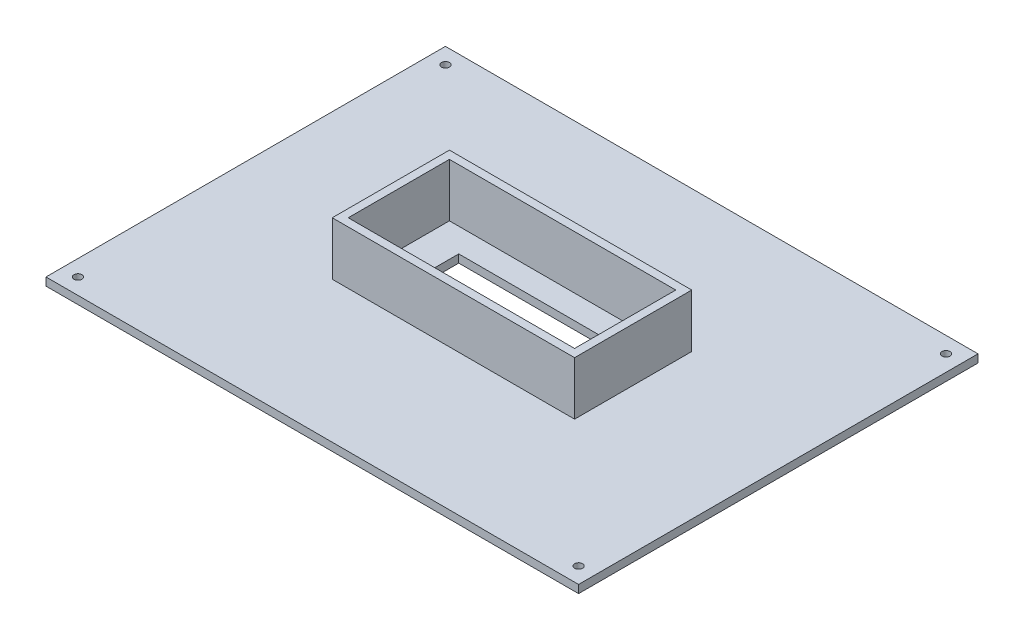
ISO-10303-21;
HEADER;
FILE_DESCRIPTION(('STEP AP214'),'2;1');
FILE_NAME('part.step','',(''),(''),'','','');
FILE_SCHEMA(('AUTOMOTIVE_DESIGN { 1 0 10303 214 1 1 1 1 }'));
ENDSEC;
DATA;
#1=APPLICATION_CONTEXT('core data for automotive mechanical design processes');
#2=APPLICATION_PROTOCOL_DEFINITION('international standard','automotive_design',2000,#1);
#3=PRODUCT_CONTEXT('',#1,'mechanical');
#4=PRODUCT('Part','Part','',(#3));
#5=PRODUCT_RELATED_PRODUCT_CATEGORY('part','',(#4));
#6=PRODUCT_DEFINITION_FORMATION('','',#4);
#7=PRODUCT_DEFINITION_CONTEXT('part definition',#1,'design');
#8=PRODUCT_DEFINITION('design','',#6,#7);
#9=PRODUCT_DEFINITION_SHAPE('','',#8);
#10=(LENGTH_UNIT() NAMED_UNIT(*) SI_UNIT(.MILLI.,.METRE.));
#11=(NAMED_UNIT(*) PLANE_ANGLE_UNIT() SI_UNIT($,.RADIAN.));
#12=(NAMED_UNIT(*) SI_UNIT($,.STERADIAN.) SOLID_ANGLE_UNIT());
#13=UNCERTAINTY_MEASURE_WITH_UNIT(LENGTH_MEASURE(1.E-05),#10,'distance_accuracy_value','');
#14=(GEOMETRIC_REPRESENTATION_CONTEXT(3) GLOBAL_UNCERTAINTY_ASSIGNED_CONTEXT((#13)) GLOBAL_UNIT_ASSIGNED_CONTEXT((#10,
#11,#12)) REPRESENTATION_CONTEXT('',''));
#15=CARTESIAN_POINT('',(0.,0.,0.));
#16=DIRECTION('',(0.,0.,1.));
#17=DIRECTION('',(1.,0.,0.));
#18=AXIS2_PLACEMENT_3D('',#15,#16,#17);
#19=CARTESIAN_POINT('',(0.,3.,0.));
#20=DIRECTION('',(0.,1.,0.));
#21=DIRECTION('',(0.,0.,1.));
#22=AXIS2_PLACEMENT_3D('',#19,#20,#21);
#23=PLANE('',#22);
#24=CARTESIAN_POINT('',(94.,3.,-69.));
#25=DIRECTION('',(0.,1.,0.));
#26=DIRECTION('',(0.,0.,-1.));
#27=AXIS2_PLACEMENT_3D('',#24,#25,#26);
#28=CIRCLE('',#27,1.5);
#29=CARTESIAN_POINT('',(94.,3.,-70.5));
#30=VERTEX_POINT('',#29);
#31=EDGE_CURVE('E302',#30,#30,#28,.T.);
#32=ORIENTED_EDGE('',*,*,#31,.F.);
#33=EDGE_LOOP('',(#32));
#34=FACE_BOUND('',#33,.T.);
#35=CARTESIAN_POINT('',(-94.,3.,69.));
#36=DIRECTION('',(0.,1.,0.));
#37=DIRECTION('',(0.,0.,-1.));
#38=AXIS2_PLACEMENT_3D('',#35,#36,#37);
#39=CIRCLE('',#38,1.5);
#40=CARTESIAN_POINT('',(-94.,3.,67.5));
#41=VERTEX_POINT('',#40);
#42=EDGE_CURVE('E293',#41,#41,#39,.T.);
#43=ORIENTED_EDGE('',*,*,#42,.F.);
#44=EDGE_LOOP('',(#43));
#45=FACE_BOUND('',#44,.T.);
#46=CARTESIAN_POINT('',(-94.,3.,-69.));
#47=DIRECTION('',(0.,1.,0.));
#48=DIRECTION('',(0.,0.,1.));
#49=AXIS2_PLACEMENT_3D('',#46,#47,#48);
#50=CIRCLE('',#49,1.5);
#51=CARTESIAN_POINT('',(-94.,3.,-67.5));
#52=VERTEX_POINT('',#51);
#53=EDGE_CURVE('E279',#52,#52,#50,.T.);
#54=ORIENTED_EDGE('',*,*,#53,.F.);
#55=EDGE_LOOP('',(#54));
#56=FACE_BOUND('',#55,.T.);
#57=CARTESIAN_POINT('',(94.,3.,69.));
#58=DIRECTION('',(0.,1.,0.));
#59=DIRECTION('',(0.,0.,1.));
#60=AXIS2_PLACEMENT_3D('',#57,#58,#59);
#61=CIRCLE('',#60,1.5);
#62=CARTESIAN_POINT('',(94.,3.,70.5));
#63=VERTEX_POINT('',#62);
#64=EDGE_CURVE('E301',#63,#63,#61,.T.);
#65=ORIENTED_EDGE('',*,*,#64,.F.);
#66=EDGE_LOOP('',(#65));
#67=FACE_BOUND('',#66,.T.);
#68=DIRECTION('',(0.,0.,-1.));
#69=VECTOR('',#68,1.);
#70=CARTESIAN_POINT('',(100.,3.,-75.));
#71=LINE('',#70,#69);
#72=CARTESIAN_POINT('',(100.,3.,75.));
#73=VERTEX_POINT('',#72);
#74=CARTESIAN_POINT('',(100.,3.,-75.));
#75=VERTEX_POINT('',#74);
#76=EDGE_CURVE('E321',#73,#75,#71,.T.);
#77=ORIENTED_EDGE('',*,*,#76,.T.);
#78=DIRECTION('',(-1.,0.,0.));
#79=VECTOR('',#78,1.);
#80=CARTESIAN_POINT('',(-100.,3.,-75.));
#81=LINE('',#80,#79);
#82=CARTESIAN_POINT('',(-100.,3.,-75.));
#83=VERTEX_POINT('',#82);
#84=EDGE_CURVE('E325',#75,#83,#81,.T.);
#85=ORIENTED_EDGE('',*,*,#84,.T.);
#86=DIRECTION('',(0.,0.,1.));
#87=VECTOR('',#86,1.);
#88=CARTESIAN_POINT('',(-100.,3.,-75.));
#89=LINE('',#88,#87);
#90=CARTESIAN_POINT('',(-100.,3.,75.));
#91=VERTEX_POINT('',#90);
#92=EDGE_CURVE('E329',#83,#91,#89,.T.);
#93=ORIENTED_EDGE('',*,*,#92,.T.);
#94=DIRECTION('',(1.,0.,0.));
#95=VECTOR('',#94,1.);
#96=CARTESIAN_POINT('',(-100.,3.,75.));
#97=LINE('',#96,#95);
#98=EDGE_CURVE('E332',#91,#73,#97,.T.);
#99=ORIENTED_EDGE('',*,*,#98,.T.);
#100=EDGE_LOOP('',(#77,#85,#93,#99));
#101=FACE_BOUND('',#100,.T.);
#102=DIRECTION('',(1.,0.,0.));
#103=VECTOR('',#102,1.);
#104=CARTESIAN_POINT('',(-45.5,3.,22.));
#105=LINE('',#104,#103);
#106=CARTESIAN_POINT('',(-45.5,3.,22.));
#107=VERTEX_POINT('',#106);
#108=CARTESIAN_POINT('',(45.5,3.,22.));
#109=VERTEX_POINT('',#108);
#110=EDGE_CURVE('E224',#107,#109,#105,.T.);
#111=ORIENTED_EDGE('',*,*,#110,.F.);
#112=DIRECTION('',(0.,0.,1.));
#113=VECTOR('',#112,1.);
#114=CARTESIAN_POINT('',(-45.5,3.,-22.));
#115=LINE('',#114,#113);
#116=CARTESIAN_POINT('',(-45.5,3.,-22.));
#117=VERTEX_POINT('',#116);
#118=EDGE_CURVE('E174',#117,#107,#115,.T.);
#119=ORIENTED_EDGE('',*,*,#118,.F.);
#120=DIRECTION('',(-1.,0.,0.));
#121=VECTOR('',#120,1.);
#122=CARTESIAN_POINT('',(-45.5,3.,-22.));
#123=LINE('',#122,#121);
#124=CARTESIAN_POINT('',(45.5,3.,-22.));
#125=VERTEX_POINT('',#124);
#126=EDGE_CURVE('E211',#125,#117,#123,.T.);
#127=ORIENTED_EDGE('',*,*,#126,.F.);
#128=DIRECTION('',(0.,0.,-1.));
#129=VECTOR('',#128,1.);
#130=CARTESIAN_POINT('',(45.5,3.,-22.));
#131=LINE('',#130,#129);
#132=EDGE_CURVE('E227',#109,#125,#131,.T.);
#133=ORIENTED_EDGE('',*,*,#132,.F.);
#134=EDGE_LOOP('',(#111,#119,#127,#133));
#135=FACE_BOUND('',#134,.T.);
#136=ADVANCED_FACE('F39',(#34,#45,#56,#67,#101,#135),#23,.T.);
#137=CARTESIAN_POINT('',(100.,3.,-75.));
#138=DIRECTION('',(-1.,0.,0.));
#139=DIRECTION('',(0.,0.,1.));
#140=AXIS2_PLACEMENT_3D('',#137,#138,#139);
#141=PLANE('',#140);
#142=DIRECTION('',(0.,0.,-1.));
#143=VECTOR('',#142,1.);
#144=CARTESIAN_POINT('',(100.,0.,-75.));
#145=LINE('',#144,#143);
#146=CARTESIAN_POINT('',(100.,0.,75.));
#147=VERTEX_POINT('',#146);
#148=CARTESIAN_POINT('',(100.,0.,-75.));
#149=VERTEX_POINT('',#148);
#150=EDGE_CURVE('E317',#147,#149,#145,.T.);
#151=ORIENTED_EDGE('',*,*,#150,.T.);
#152=DIRECTION('',(0.,-1.,0.));
#153=VECTOR('',#152,1.);
#154=CARTESIAN_POINT('',(100.,3.,-75.));
#155=LINE('',#154,#153);
#156=EDGE_CURVE('E11',#75,#149,#155,.T.);
#157=ORIENTED_EDGE('',*,*,#156,.F.);
#158=ORIENTED_EDGE('',*,*,#76,.F.);
#159=DIRECTION('',(0.,-1.,0.));
#160=VECTOR('',#159,1.);
#161=CARTESIAN_POINT('',(100.,3.,75.));
#162=LINE('',#161,#160);
#163=EDGE_CURVE('E335',#73,#147,#162,.T.);
#164=ORIENTED_EDGE('',*,*,#163,.T.);
#165=EDGE_LOOP('',(#151,#157,#158,#164));
#166=FACE_BOUND('',#165,.T.);
#167=ADVANCED_FACE('F41',(#166),#141,.F.);
#168=CARTESIAN_POINT('',(-100.,3.,-75.));
#169=DIRECTION('',(0.,0.,1.));
#170=DIRECTION('',(1.,0.,0.));
#171=AXIS2_PLACEMENT_3D('',#168,#169,#170);
#172=PLANE('',#171);
#173=DIRECTION('',(-1.,0.,0.));
#174=VECTOR('',#173,1.);
#175=CARTESIAN_POINT('',(-100.,0.,-75.));
#176=LINE('',#175,#174);
#177=CARTESIAN_POINT('',(-100.,0.,-75.));
#178=VERTEX_POINT('',#177);
#179=EDGE_CURVE('E339',#149,#178,#176,.T.);
#180=ORIENTED_EDGE('',*,*,#179,.T.);
#181=DIRECTION('',(0.,-1.,0.));
#182=VECTOR('',#181,1.);
#183=CARTESIAN_POINT('',(-100.,3.,-75.));
#184=LINE('',#183,#182);
#185=EDGE_CURVE('E48',#83,#178,#184,.T.);
#186=ORIENTED_EDGE('',*,*,#185,.F.);
#187=ORIENTED_EDGE('',*,*,#84,.F.);
#188=ORIENTED_EDGE('',*,*,#156,.T.);
#189=EDGE_LOOP('',(#180,#186,#187,#188));
#190=FACE_BOUND('',#189,.T.);
#191=ADVANCED_FACE('F375',(#190),#172,.F.);
#192=CARTESIAN_POINT('',(-100.,3.,-75.));
#193=DIRECTION('',(1.,0.,0.));
#194=DIRECTION('',(0.,0.,-1.));
#195=AXIS2_PLACEMENT_3D('',#192,#193,#194);
#196=PLANE('',#195);
#197=DIRECTION('',(0.,0.,1.));
#198=VECTOR('',#197,1.);
#199=CARTESIAN_POINT('',(-100.,0.,-75.));
#200=LINE('',#199,#198);
#201=CARTESIAN_POINT('',(-100.,0.,75.));
#202=VERTEX_POINT('',#201);
#203=EDGE_CURVE('E342',#178,#202,#200,.T.);
#204=ORIENTED_EDGE('',*,*,#203,.T.);
#205=DIRECTION('',(0.,-1.,0.));
#206=VECTOR('',#205,1.);
#207=CARTESIAN_POINT('',(-100.,3.,75.));
#208=LINE('',#207,#206);
#209=EDGE_CURVE('E350',#91,#202,#208,.T.);
#210=ORIENTED_EDGE('',*,*,#209,.F.);
#211=ORIENTED_EDGE('',*,*,#92,.F.);
#212=ORIENTED_EDGE('',*,*,#185,.T.);
#213=EDGE_LOOP('',(#204,#210,#211,#212));
#214=FACE_BOUND('',#213,.T.);
#215=ADVANCED_FACE('F359',(#214),#196,.F.);
#216=CARTESIAN_POINT('',(-100.,3.,75.));
#217=DIRECTION('',(0.,0.,-1.));
#218=DIRECTION('',(-1.,0.,0.));
#219=AXIS2_PLACEMENT_3D('',#216,#217,#218);
#220=PLANE('',#219);
#221=DIRECTION('',(1.,0.,0.));
#222=VECTOR('',#221,1.);
#223=CARTESIAN_POINT('',(-100.,0.,75.));
#224=LINE('',#223,#222);
#225=EDGE_CURVE('E326',#202,#147,#224,.T.);
#226=ORIENTED_EDGE('',*,*,#225,.T.);
#227=ORIENTED_EDGE('',*,*,#163,.F.);
#228=ORIENTED_EDGE('',*,*,#98,.F.);
#229=ORIENTED_EDGE('',*,*,#209,.T.);
#230=EDGE_LOOP('',(#226,#227,#228,#229));
#231=FACE_BOUND('',#230,.T.);
#232=ADVANCED_FACE('F368',(#231),#220,.F.);
#233=DIRECTION('',(0.,0.,-1.));
#234=VECTOR('',#233,1.);
#235=CARTESIAN_POINT('',(42.5,3.,-19.));
#236=LINE('',#235,#234);
#237=CARTESIAN_POINT('',(42.5,3.,19.));
#238=VERTEX_POINT('',#237);
#239=CARTESIAN_POINT('',(42.5,3.,-19.));
#240=VERTEX_POINT('',#239);
#241=EDGE_CURVE('E63',#238,#240,#236,.T.);
#242=ORIENTED_EDGE('',*,*,#241,.T.);
#243=DIRECTION('',(-1.,0.,0.));
#244=VECTOR('',#243,1.);
#245=CARTESIAN_POINT('',(-42.5,3.,-19.));
#246=LINE('',#245,#244);
#247=CARTESIAN_POINT('',(-42.5,3.,-19.));
#248=VERTEX_POINT('',#247);
#249=EDGE_CURVE('E172',#240,#248,#246,.T.);
#250=ORIENTED_EDGE('',*,*,#249,.T.);
#251=DIRECTION('',(0.,0.,1.));
#252=VECTOR('',#251,1.);
#253=CARTESIAN_POINT('',(-42.5,3.,-19.));
#254=LINE('',#253,#252);
#255=CARTESIAN_POINT('',(-42.5,3.,19.));
#256=VERTEX_POINT('',#255);
#257=EDGE_CURVE('E193',#248,#256,#254,.T.);
#258=ORIENTED_EDGE('',*,*,#257,.T.);
#259=DIRECTION('',(1.,0.,0.));
#260=VECTOR('',#259,1.);
#261=CARTESIAN_POINT('',(-42.5,3.,19.));
#262=LINE('',#261,#260);
#263=EDGE_CURVE('E166',#256,#238,#262,.T.);
#264=ORIENTED_EDGE('',*,*,#263,.T.);
#265=EDGE_LOOP('',(#242,#250,#258,#264));
#266=FACE_BOUND('',#265,.T.);
#267=DIRECTION('',(0.,0.,-1.));
#268=VECTOR('',#267,1.);
#269=CARTESIAN_POINT('',(30.,3.,-10.));
#270=LINE('',#269,#268);
#271=CARTESIAN_POINT('',(30.,3.,9.99999999999999));
#272=VERTEX_POINT('',#271);
#273=CARTESIAN_POINT('',(30.,3.,-10.));
#274=VERTEX_POINT('',#273);
#275=EDGE_CURVE('E244',#272,#274,#270,.T.);
#276=ORIENTED_EDGE('',*,*,#275,.F.);
#277=DIRECTION('',(1.,0.,0.));
#278=VECTOR('',#277,1.);
#279=CARTESIAN_POINT('',(-30.,3.,9.99999999999999));
#280=LINE('',#279,#278);
#281=CARTESIAN_POINT('',(-30.,3.,9.99999999999999));
#282=VERTEX_POINT('',#281);
#283=EDGE_CURVE('E250',#282,#272,#280,.T.);
#284=ORIENTED_EDGE('',*,*,#283,.F.);
#285=DIRECTION('',(0.,0.,1.));
#286=VECTOR('',#285,1.);
#287=CARTESIAN_POINT('',(-30.,3.,-10.));
#288=LINE('',#287,#286);
#289=CARTESIAN_POINT('',(-30.,3.,-10.));
#290=VERTEX_POINT('',#289);
#291=EDGE_CURVE('E269',#290,#282,#288,.T.);
#292=ORIENTED_EDGE('',*,*,#291,.F.);
#293=DIRECTION('',(-1.,0.,0.));
#294=VECTOR('',#293,1.);
#295=CARTESIAN_POINT('',(-30.,3.,-10.));
#296=LINE('',#295,#294);
#297=EDGE_CURVE('E265',#274,#290,#296,.T.);
#298=ORIENTED_EDGE('',*,*,#297,.F.);
#299=EDGE_LOOP('',(#276,#284,#292,#298));
#300=FACE_BOUND('',#299,.T.);
#301=ADVANCED_FACE('F385',(#266,#300),#23,.T.);
#302=CARTESIAN_POINT('',(0.,0.,0.));
#303=DIRECTION('',(0.,1.,0.));
#304=DIRECTION('',(0.,0.,1.));
#305=AXIS2_PLACEMENT_3D('',#302,#303,#304);
#306=PLANE('',#305);
#307=DIRECTION('',(1.,0.,0.));
#308=VECTOR('',#307,1.);
#309=CARTESIAN_POINT('',(-30.,0.,9.99999999999999));
#310=LINE('',#309,#308);
#311=CARTESIAN_POINT('',(-30.,0.,9.99999999999999));
#312=VERTEX_POINT('',#311);
#313=CARTESIAN_POINT('',(30.,0.,9.99999999999999));
#314=VERTEX_POINT('',#313);
#315=EDGE_CURVE('E258',#312,#314,#310,.T.);
#316=ORIENTED_EDGE('',*,*,#315,.T.);
#317=DIRECTION('',(0.,0.,-1.));
#318=VECTOR('',#317,1.);
#319=CARTESIAN_POINT('',(30.,0.,-10.));
#320=LINE('',#319,#318);
#321=CARTESIAN_POINT('',(30.,0.,-10.));
#322=VERTEX_POINT('',#321);
#323=EDGE_CURVE('E245',#314,#322,#320,.T.);
#324=ORIENTED_EDGE('',*,*,#323,.T.);
#325=DIRECTION('',(-1.,0.,0.));
#326=VECTOR('',#325,1.);
#327=CARTESIAN_POINT('',(-30.,0.,-10.));
#328=LINE('',#327,#326);
#329=CARTESIAN_POINT('',(-30.,0.,-10.));
#330=VERTEX_POINT('',#329);
#331=EDGE_CURVE('E249',#322,#330,#328,.T.);
#332=ORIENTED_EDGE('',*,*,#331,.T.);
#333=DIRECTION('',(0.,0.,1.));
#334=VECTOR('',#333,1.);
#335=CARTESIAN_POINT('',(-30.,0.,-10.));
#336=LINE('',#335,#334);
#337=EDGE_CURVE('E254',#330,#312,#336,.T.);
#338=ORIENTED_EDGE('',*,*,#337,.T.);
#339=EDGE_LOOP('',(#316,#324,#332,#338));
#340=FACE_BOUND('',#339,.T.);
#341=CARTESIAN_POINT('',(94.,0.,-69.));
#342=DIRECTION('',(0.,1.,0.));
#343=DIRECTION('',(0.,0.,-1.));
#344=AXIS2_PLACEMENT_3D('',#341,#342,#343);
#345=CIRCLE('',#344,1.5);
#346=CARTESIAN_POINT('',(94.,0.,-70.5));
#347=VERTEX_POINT('',#346);
#348=EDGE_CURVE('E297',#347,#347,#345,.T.);
#349=ORIENTED_EDGE('',*,*,#348,.T.);
#350=EDGE_LOOP('',(#349));
#351=FACE_BOUND('',#350,.T.);
#352=CARTESIAN_POINT('',(-94.,0.,69.));
#353=DIRECTION('',(0.,1.,0.));
#354=DIRECTION('',(0.,0.,-1.));
#355=AXIS2_PLACEMENT_3D('',#352,#353,#354);
#356=CIRCLE('',#355,1.5);
#357=CARTESIAN_POINT('',(-94.,0.,67.5));
#358=VERTEX_POINT('',#357);
#359=EDGE_CURVE('E306',#358,#358,#356,.T.);
#360=ORIENTED_EDGE('',*,*,#359,.T.);
#361=EDGE_LOOP('',(#360));
#362=FACE_BOUND('',#361,.T.);
#363=CARTESIAN_POINT('',(-94.,0.,-69.));
#364=DIRECTION('',(0.,1.,0.));
#365=DIRECTION('',(0.,0.,1.));
#366=AXIS2_PLACEMENT_3D('',#363,#364,#365);
#367=CIRCLE('',#366,1.5);
#368=CARTESIAN_POINT('',(-94.,0.,-67.5));
#369=VERTEX_POINT('',#368);
#370=EDGE_CURVE('E289',#369,#369,#367,.T.);
#371=ORIENTED_EDGE('',*,*,#370,.T.);
#372=EDGE_LOOP('',(#371));
#373=FACE_BOUND('',#372,.T.);
#374=CARTESIAN_POINT('',(94.,0.,69.));
#375=DIRECTION('',(0.,1.,0.));
#376=DIRECTION('',(0.,0.,1.));
#377=AXIS2_PLACEMENT_3D('',#374,#375,#376);
#378=CIRCLE('',#377,1.5);
#379=CARTESIAN_POINT('',(94.,0.,70.5));
#380=VERTEX_POINT('',#379);
#381=EDGE_CURVE('E313',#380,#380,#378,.T.);
#382=ORIENTED_EDGE('',*,*,#381,.T.);
#383=EDGE_LOOP('',(#382));
#384=FACE_BOUND('',#383,.T.);
#385=ORIENTED_EDGE('',*,*,#150,.F.);
#386=ORIENTED_EDGE('',*,*,#225,.F.);
#387=ORIENTED_EDGE('',*,*,#203,.F.);
#388=ORIENTED_EDGE('',*,*,#179,.F.);
#389=EDGE_LOOP('',(#385,#386,#387,#388));
#390=FACE_BOUND('',#389,.T.);
#391=ADVANCED_FACE('F365',(#340,#351,#362,#373,#384,#390),#306,.F.);
#392=CARTESIAN_POINT('',(94.,0.,69.));
#393=DIRECTION('',(0.,1.,0.));
#394=DIRECTION('',(0.,0.,1.));
#395=AXIS2_PLACEMENT_3D('',#392,#393,#394);
#396=CYLINDRICAL_SURFACE('',#395,1.5);
#397=ORIENTED_EDGE('',*,*,#381,.F.);
#398=EDGE_LOOP('',(#397));
#399=FACE_BOUND('',#398,.T.);
#400=ORIENTED_EDGE('',*,*,#64,.T.);
#401=EDGE_LOOP('',(#400));
#402=FACE_BOUND('',#401,.T.);
#403=ADVANCED_FACE('F397',(#399,#402),#396,.F.);
#404=CARTESIAN_POINT('',(-94.,0.,-69.));
#405=DIRECTION('',(0.,1.,0.));
#406=DIRECTION('',(0.,0.,1.));
#407=AXIS2_PLACEMENT_3D('',#404,#405,#406);
#408=CYLINDRICAL_SURFACE('',#407,1.5);
#409=ORIENTED_EDGE('',*,*,#370,.F.);
#410=EDGE_LOOP('',(#409));
#411=FACE_BOUND('',#410,.T.);
#412=ORIENTED_EDGE('',*,*,#53,.T.);
#413=EDGE_LOOP('',(#412));
#414=FACE_BOUND('',#413,.T.);
#415=ADVANCED_FACE('F431',(#411,#414),#408,.F.);
#416=CARTESIAN_POINT('',(-94.,0.,69.));
#417=DIRECTION('',(0.,1.,0.));
#418=DIRECTION('',(0.,0.,1.));
#419=AXIS2_PLACEMENT_3D('',#416,#417,#418);
#420=CYLINDRICAL_SURFACE('',#419,1.5);
#421=ORIENTED_EDGE('',*,*,#359,.F.);
#422=EDGE_LOOP('',(#421));
#423=FACE_BOUND('',#422,.T.);
#424=ORIENTED_EDGE('',*,*,#42,.T.);
#425=EDGE_LOOP('',(#424));
#426=FACE_BOUND('',#425,.T.);
#427=ADVANCED_FACE('F434',(#423,#426),#420,.F.);
#428=CARTESIAN_POINT('',(94.,0.,-69.));
#429=DIRECTION('',(0.,1.,0.));
#430=DIRECTION('',(0.,0.,1.));
#431=AXIS2_PLACEMENT_3D('',#428,#429,#430);
#432=CYLINDRICAL_SURFACE('',#431,1.5);
#433=ORIENTED_EDGE('',*,*,#348,.F.);
#434=EDGE_LOOP('',(#433));
#435=FACE_BOUND('',#434,.T.);
#436=ORIENTED_EDGE('',*,*,#31,.T.);
#437=EDGE_LOOP('',(#436));
#438=FACE_BOUND('',#437,.T.);
#439=ADVANCED_FACE('F430',(#435,#438),#432,.F.);
#440=CARTESIAN_POINT('',(30.,0.,-10.));
#441=DIRECTION('',(1.,0.,0.));
#442=DIRECTION('',(0.,0.,-1.));
#443=AXIS2_PLACEMENT_3D('',#440,#441,#442);
#444=PLANE('',#443);
#445=ORIENTED_EDGE('',*,*,#275,.T.);
#446=DIRECTION('',(0.,1.,0.));
#447=VECTOR('',#446,1.);
#448=CARTESIAN_POINT('',(30.,0.,-10.));
#449=LINE('',#448,#447);
#450=EDGE_CURVE('E262',#322,#274,#449,.T.);
#451=ORIENTED_EDGE('',*,*,#450,.F.);
#452=ORIENTED_EDGE('',*,*,#323,.F.);
#453=DIRECTION('',(0.,1.,0.));
#454=VECTOR('',#453,1.);
#455=CARTESIAN_POINT('',(30.,0.,9.99999999999999));
#456=LINE('',#455,#454);
#457=EDGE_CURVE('E276',#314,#272,#456,.T.);
#458=ORIENTED_EDGE('',*,*,#457,.T.);
#459=EDGE_LOOP('',(#445,#451,#452,#458));
#460=FACE_BOUND('',#459,.T.);
#461=ADVANCED_FACE('F406',(#460),#444,.F.);
#462=CARTESIAN_POINT('',(-30.,0.,9.99999999999999));
#463=DIRECTION('',(0.,0.,1.));
#464=DIRECTION('',(1.,0.,0.));
#465=AXIS2_PLACEMENT_3D('',#462,#463,#464);
#466=PLANE('',#465);
#467=ORIENTED_EDGE('',*,*,#283,.T.);
#468=ORIENTED_EDGE('',*,*,#457,.F.);
#469=ORIENTED_EDGE('',*,*,#315,.F.);
#470=DIRECTION('',(0.,1.,0.));
#471=VECTOR('',#470,1.);
#472=CARTESIAN_POINT('',(-30.,0.,9.99999999999999));
#473=LINE('',#472,#471);
#474=EDGE_CURVE('E280',#312,#282,#473,.T.);
#475=ORIENTED_EDGE('',*,*,#474,.T.);
#476=EDGE_LOOP('',(#467,#468,#469,#475));
#477=FACE_BOUND('',#476,.T.);
#478=ADVANCED_FACE('F415',(#477),#466,.F.);
#479=CARTESIAN_POINT('',(-30.,0.,-10.));
#480=DIRECTION('',(-1.,0.,0.));
#481=DIRECTION('',(0.,0.,1.));
#482=AXIS2_PLACEMENT_3D('',#479,#480,#481);
#483=PLANE('',#482);
#484=ORIENTED_EDGE('',*,*,#291,.T.);
#485=ORIENTED_EDGE('',*,*,#474,.F.);
#486=ORIENTED_EDGE('',*,*,#337,.F.);
#487=DIRECTION('',(0.,1.,0.));
#488=VECTOR('',#487,1.);
#489=CARTESIAN_POINT('',(-30.,0.,-10.));
#490=LINE('',#489,#488);
#491=EDGE_CURVE('E283',#330,#290,#490,.T.);
#492=ORIENTED_EDGE('',*,*,#491,.T.);
#493=EDGE_LOOP('',(#484,#485,#486,#492));
#494=FACE_BOUND('',#493,.T.);
#495=ADVANCED_FACE('F417',(#494),#483,.F.);
#496=CARTESIAN_POINT('',(-30.,0.,-10.));
#497=DIRECTION('',(0.,0.,-1.));
#498=DIRECTION('',(-1.,0.,0.));
#499=AXIS2_PLACEMENT_3D('',#496,#497,#498);
#500=PLANE('',#499);
#501=ORIENTED_EDGE('',*,*,#297,.T.);
#502=ORIENTED_EDGE('',*,*,#491,.F.);
#503=ORIENTED_EDGE('',*,*,#331,.F.);
#504=ORIENTED_EDGE('',*,*,#450,.T.);
#505=EDGE_LOOP('',(#501,#502,#503,#504));
#506=FACE_BOUND('',#505,.T.);
#507=ADVANCED_FACE('F410',(#506),#500,.F.);
#508=CARTESIAN_POINT('',(0.,23.,0.));
#509=DIRECTION('',(0.,1.,0.));
#510=DIRECTION('',(0.,0.,1.));
#511=AXIS2_PLACEMENT_3D('',#508,#509,#510);
#512=PLANE('',#511);
#513=DIRECTION('',(0.,0.,1.));
#514=VECTOR('',#513,1.);
#515=CARTESIAN_POINT('',(-45.5,23.,-22.));
#516=LINE('',#515,#514);
#517=CARTESIAN_POINT('',(-45.5,23.,-22.));
#518=VERTEX_POINT('',#517);
#519=CARTESIAN_POINT('',(-45.5,23.,22.));
#520=VERTEX_POINT('',#519);
#521=EDGE_CURVE('E206',#518,#520,#516,.T.);
#522=ORIENTED_EDGE('',*,*,#521,.T.);
#523=DIRECTION('',(1.,0.,0.));
#524=VECTOR('',#523,1.);
#525=CARTESIAN_POINT('',(-45.5,23.,22.));
#526=LINE('',#525,#524);
#527=CARTESIAN_POINT('',(45.5,23.,22.));
#528=VERTEX_POINT('',#527);
#529=EDGE_CURVE('E210',#520,#528,#526,.T.);
#530=ORIENTED_EDGE('',*,*,#529,.T.);
#531=DIRECTION('',(0.,0.,-1.));
#532=VECTOR('',#531,1.);
#533=CARTESIAN_POINT('',(45.5,23.,-22.));
#534=LINE('',#533,#532);
#535=CARTESIAN_POINT('',(45.5,23.,-22.));
#536=VERTEX_POINT('',#535);
#537=EDGE_CURVE('E214',#528,#536,#534,.T.);
#538=ORIENTED_EDGE('',*,*,#537,.T.);
#539=DIRECTION('',(-1.,0.,0.));
#540=VECTOR('',#539,1.);
#541=CARTESIAN_POINT('',(-45.5,23.,-22.));
#542=LINE('',#541,#540);
#543=EDGE_CURVE('E217',#536,#518,#542,.T.);
#544=ORIENTED_EDGE('',*,*,#543,.T.);
#545=EDGE_LOOP('',(#522,#530,#538,#544));
#546=FACE_BOUND('',#545,.T.);
#547=DIRECTION('',(-1.,0.,0.));
#548=VECTOR('',#547,1.);
#549=CARTESIAN_POINT('',(-42.5,23.,-19.));
#550=LINE('',#549,#548);
#551=CARTESIAN_POINT('',(42.5,23.,-19.));
#552=VERTEX_POINT('',#551);
#553=CARTESIAN_POINT('',(-42.5,23.,-19.));
#554=VERTEX_POINT('',#553);
#555=EDGE_CURVE('E165',#552,#554,#550,.T.);
#556=ORIENTED_EDGE('',*,*,#555,.F.);
#557=DIRECTION('',(0.,0.,-1.));
#558=VECTOR('',#557,1.);
#559=CARTESIAN_POINT('',(42.5,23.,-19.));
#560=LINE('',#559,#558);
#561=CARTESIAN_POINT('',(42.5,23.,19.));
#562=VERTEX_POINT('',#561);
#563=EDGE_CURVE('E155',#562,#552,#560,.T.);
#564=ORIENTED_EDGE('',*,*,#563,.F.);
#565=DIRECTION('',(1.,0.,0.));
#566=VECTOR('',#565,1.);
#567=CARTESIAN_POINT('',(-42.5,23.,19.));
#568=LINE('',#567,#566);
#569=CARTESIAN_POINT('',(-42.5,23.,19.));
#570=VERTEX_POINT('',#569);
#571=EDGE_CURVE('E184',#570,#562,#568,.T.);
#572=ORIENTED_EDGE('',*,*,#571,.F.);
#573=DIRECTION('',(0.,0.,1.));
#574=VECTOR('',#573,1.);
#575=CARTESIAN_POINT('',(-42.5,23.,-19.));
#576=LINE('',#575,#574);
#577=EDGE_CURVE('E180',#554,#570,#576,.T.);
#578=ORIENTED_EDGE('',*,*,#577,.F.);
#579=EDGE_LOOP('',(#556,#564,#572,#578));
#580=FACE_BOUND('',#579,.T.);
#581=ADVANCED_FACE('F178',(#546,#580),#512,.T.);
#582=CARTESIAN_POINT('',(-45.5,23.,-22.));
#583=DIRECTION('',(1.,0.,0.));
#584=DIRECTION('',(0.,0.,-1.));
#585=AXIS2_PLACEMENT_3D('',#582,#583,#584);
#586=PLANE('',#585);
#587=ORIENTED_EDGE('',*,*,#118,.T.);
#588=DIRECTION('',(0.,-1.,0.));
#589=VECTOR('',#588,1.);
#590=CARTESIAN_POINT('',(-45.5,23.,22.));
#591=LINE('',#590,#589);
#592=EDGE_CURVE('E241',#520,#107,#591,.T.);
#593=ORIENTED_EDGE('',*,*,#592,.F.);
#594=ORIENTED_EDGE('',*,*,#521,.F.);
#595=DIRECTION('',(0.,-1.,0.));
#596=VECTOR('',#595,1.);
#597=CARTESIAN_POINT('',(-45.5,23.,-22.));
#598=LINE('',#597,#596);
#599=EDGE_CURVE('E220',#518,#117,#598,.T.);
#600=ORIENTED_EDGE('',*,*,#599,.T.);
#601=EDGE_LOOP('',(#587,#593,#594,#600));
#602=FACE_BOUND('',#601,.T.);
#603=ADVANCED_FACE('F502',(#602),#586,.F.);
#604=CARTESIAN_POINT('',(-45.5,23.,22.));
#605=DIRECTION('',(0.,0.,-1.));
#606=DIRECTION('',(-1.,0.,0.));
#607=AXIS2_PLACEMENT_3D('',#604,#605,#606);
#608=PLANE('',#607);
#609=ORIENTED_EDGE('',*,*,#110,.T.);
#610=DIRECTION('',(0.,-1.,0.));
#611=VECTOR('',#610,1.);
#612=CARTESIAN_POINT('',(45.5,23.,22.));
#613=LINE('',#612,#611);
#614=EDGE_CURVE('E237',#528,#109,#613,.T.);
#615=ORIENTED_EDGE('',*,*,#614,.F.);
#616=ORIENTED_EDGE('',*,*,#529,.F.);
#617=ORIENTED_EDGE('',*,*,#592,.T.);
#618=EDGE_LOOP('',(#609,#615,#616,#617));
#619=FACE_BOUND('',#618,.T.);
#620=ADVANCED_FACE('F512',(#619),#608,.F.);
#621=CARTESIAN_POINT('',(45.5,23.,-22.));
#622=DIRECTION('',(-1.,0.,0.));
#623=DIRECTION('',(0.,0.,1.));
#624=AXIS2_PLACEMENT_3D('',#621,#622,#623);
#625=PLANE('',#624);
#626=ORIENTED_EDGE('',*,*,#132,.T.);
#627=DIRECTION('',(0.,-1.,0.));
#628=VECTOR('',#627,1.);
#629=CARTESIAN_POINT('',(45.5,23.,-22.));
#630=LINE('',#629,#628);
#631=EDGE_CURVE('E55',#536,#125,#630,.T.);
#632=ORIENTED_EDGE('',*,*,#631,.F.);
#633=ORIENTED_EDGE('',*,*,#537,.F.);
#634=ORIENTED_EDGE('',*,*,#614,.T.);
#635=EDGE_LOOP('',(#626,#632,#633,#634));
#636=FACE_BOUND('',#635,.T.);
#637=ADVANCED_FACE('F521',(#636),#625,.F.);
#638=CARTESIAN_POINT('',(-45.5,23.,-22.));
#639=DIRECTION('',(0.,0.,1.));
#640=DIRECTION('',(1.,0.,0.));
#641=AXIS2_PLACEMENT_3D('',#638,#639,#640);
#642=PLANE('',#641);
#643=ORIENTED_EDGE('',*,*,#126,.T.);
#644=ORIENTED_EDGE('',*,*,#599,.F.);
#645=ORIENTED_EDGE('',*,*,#543,.F.);
#646=ORIENTED_EDGE('',*,*,#631,.T.);
#647=EDGE_LOOP('',(#643,#644,#645,#646));
#648=FACE_BOUND('',#647,.T.);
#649=ADVANCED_FACE('F531',(#648),#642,.F.);
#650=CARTESIAN_POINT('',(42.5,23.,-19.));
#651=DIRECTION('',(-1.,0.,0.));
#652=DIRECTION('',(0.,0.,1.));
#653=AXIS2_PLACEMENT_3D('',#650,#651,#652);
#654=PLANE('',#653);
#655=ORIENTED_EDGE('',*,*,#241,.F.);
#656=DIRECTION('',(0.,-1.,0.));
#657=VECTOR('',#656,1.);
#658=CARTESIAN_POINT('',(42.5,23.,19.));
#659=LINE('',#658,#657);
#660=EDGE_CURVE('E160',#562,#238,#659,.T.);
#661=ORIENTED_EDGE('',*,*,#660,.F.);
#662=ORIENTED_EDGE('',*,*,#563,.T.);
#663=DIRECTION('',(0.,-1.,0.));
#664=VECTOR('',#663,1.);
#665=CARTESIAN_POINT('',(42.5,23.,-19.));
#666=LINE('',#665,#664);
#667=EDGE_CURVE('E158',#552,#240,#666,.T.);
#668=ORIENTED_EDGE('',*,*,#667,.T.);
#669=EDGE_LOOP('',(#655,#661,#662,#668));
#670=FACE_BOUND('',#669,.T.);
#671=ADVANCED_FACE('F157',(#670),#654,.T.);
#672=CARTESIAN_POINT('',(-42.5,23.,-19.));
#673=DIRECTION('',(0.,0.,1.));
#674=DIRECTION('',(1.,0.,0.));
#675=AXIS2_PLACEMENT_3D('',#672,#673,#674);
#676=PLANE('',#675);
#677=ORIENTED_EDGE('',*,*,#249,.F.);
#678=ORIENTED_EDGE('',*,*,#667,.F.);
#679=ORIENTED_EDGE('',*,*,#555,.T.);
#680=DIRECTION('',(0.,-1.,0.));
#681=VECTOR('',#680,1.);
#682=CARTESIAN_POINT('',(-42.5,23.,-19.));
#683=LINE('',#682,#681);
#684=EDGE_CURVE('E175',#554,#248,#683,.T.);
#685=ORIENTED_EDGE('',*,*,#684,.T.);
#686=EDGE_LOOP('',(#677,#678,#679,#685));
#687=FACE_BOUND('',#686,.T.);
#688=ADVANCED_FACE('F169',(#687),#676,.T.);
#689=CARTESIAN_POINT('',(-42.5,23.,-19.));
#690=DIRECTION('',(1.,0.,0.));
#691=DIRECTION('',(0.,0.,-1.));
#692=AXIS2_PLACEMENT_3D('',#689,#690,#691);
#693=PLANE('',#692);
#694=ORIENTED_EDGE('',*,*,#257,.F.);
#695=ORIENTED_EDGE('',*,*,#684,.F.);
#696=ORIENTED_EDGE('',*,*,#577,.T.);
#697=DIRECTION('',(0.,-1.,0.));
#698=VECTOR('',#697,1.);
#699=CARTESIAN_POINT('',(-42.5,23.,19.));
#700=LINE('',#699,#698);
#701=EDGE_CURVE('E200',#570,#256,#700,.T.);
#702=ORIENTED_EDGE('',*,*,#701,.T.);
#703=EDGE_LOOP('',(#694,#695,#696,#702));
#704=FACE_BOUND('',#703,.T.);
#705=ADVANCED_FACE('F557',(#704),#693,.T.);
#706=CARTESIAN_POINT('',(-42.5,23.,19.));
#707=DIRECTION('',(0.,0.,-1.));
#708=DIRECTION('',(-1.,0.,0.));
#709=AXIS2_PLACEMENT_3D('',#706,#707,#708);
#710=PLANE('',#709);
#711=ORIENTED_EDGE('',*,*,#263,.F.);
#712=ORIENTED_EDGE('',*,*,#701,.F.);
#713=ORIENTED_EDGE('',*,*,#571,.T.);
#714=ORIENTED_EDGE('',*,*,#660,.T.);
#715=EDGE_LOOP('',(#711,#712,#713,#714));
#716=FACE_BOUND('',#715,.T.);
#717=ADVANCED_FACE('F566',(#716),#710,.T.);
#718=CLOSED_SHELL('',(#136,#167,#191,#215,#232,#301,#391,#403,#415,#427,#439,#461,#478,#495,
#507,#581,#603,#620,#637,#649,#671,#688,#705,#717));
#719=MANIFOLD_SOLID_BREP('B2',#718);
#720=ADVANCED_BREP_SHAPE_REPRESENTATION('',(#18,#719),#14);
#721=SHAPE_DEFINITION_REPRESENTATION(#9,#720);
ENDSEC;
END-ISO-10303-21;
